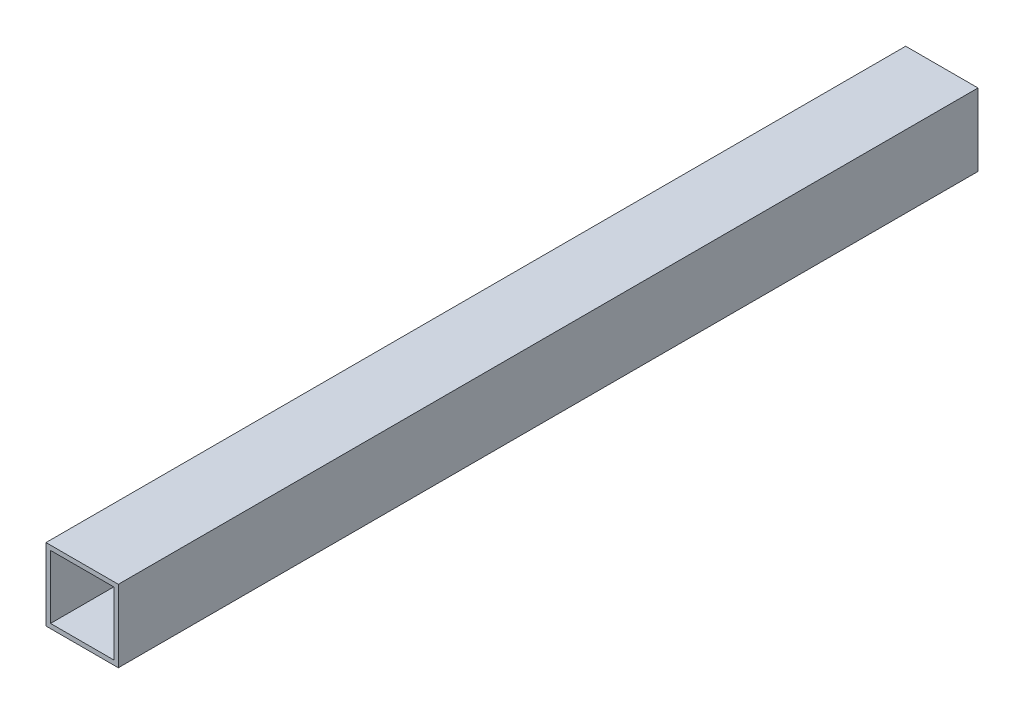
ISO-10303-21;
HEADER;
FILE_DESCRIPTION(('STEP AP214'),'2;1');
FILE_NAME('part.step','',(''),(''),'','','');
FILE_SCHEMA(('AUTOMOTIVE_DESIGN { 1 0 10303 214 1 1 1 1 }'));
ENDSEC;
DATA;
#1=APPLICATION_CONTEXT('core data for automotive mechanical design processes');
#2=APPLICATION_PROTOCOL_DEFINITION('international standard','automotive_design',2000,#1);
#3=PRODUCT_CONTEXT('',#1,'mechanical');
#4=PRODUCT('Part','Part','',(#3));
#5=PRODUCT_RELATED_PRODUCT_CATEGORY('part','',(#4));
#6=PRODUCT_DEFINITION_FORMATION('','',#4);
#7=PRODUCT_DEFINITION_CONTEXT('part definition',#1,'design');
#8=PRODUCT_DEFINITION('design','',#6,#7);
#9=PRODUCT_DEFINITION_SHAPE('','',#8);
#10=(LENGTH_UNIT() NAMED_UNIT(*) SI_UNIT(.MILLI.,.METRE.));
#11=(NAMED_UNIT(*) PLANE_ANGLE_UNIT() SI_UNIT($,.RADIAN.));
#12=(NAMED_UNIT(*) SI_UNIT($,.STERADIAN.) SOLID_ANGLE_UNIT());
#13=UNCERTAINTY_MEASURE_WITH_UNIT(LENGTH_MEASURE(1.E-05),#10,'distance_accuracy_value','');
#14=(GEOMETRIC_REPRESENTATION_CONTEXT(3) GLOBAL_UNCERTAINTY_ASSIGNED_CONTEXT((#13)) GLOBAL_UNIT_ASSIGNED_CONTEXT((#10,
#11,#12)) REPRESENTATION_CONTEXT('',''));
#15=CARTESIAN_POINT('',(0.,0.,0.));
#16=DIRECTION('',(0.,0.,1.));
#17=DIRECTION('',(1.,0.,0.));
#18=AXIS2_PLACEMENT_3D('',#15,#16,#17);
#19=CARTESIAN_POINT('',(0.,0.,150.969853));
#20=DIRECTION('',(0.,0.,-1.));
#21=DIRECTION('',(-1.,0.,0.));
#22=AXIS2_PLACEMENT_3D('',#19,#20,#21);
#23=PLANE('',#22);
#24=DIRECTION('',(0.,1.,0.));
#25=VECTOR('',#24,1.);
#26=CARTESIAN_POINT('',(12.7,-12.7,150.969853));
#27=LINE('',#26,#25);
#28=CARTESIAN_POINT('',(12.7,-12.7,150.969853));
#29=VERTEX_POINT('',#28);
#30=CARTESIAN_POINT('',(12.7,12.7,150.969853));
#31=VERTEX_POINT('',#30);
#32=EDGE_CURVE('E134',#29,#31,#27,.T.);
#33=ORIENTED_EDGE('',*,*,#32,.T.);
#34=DIRECTION('',(-1.,0.,0.));
#35=VECTOR('',#34,1.);
#36=CARTESIAN_POINT('',(-12.7,12.7,150.969853));
#37=LINE('',#36,#35);
#38=CARTESIAN_POINT('',(-12.7,12.7,150.969853));
#39=VERTEX_POINT('',#38);
#40=EDGE_CURVE('E137',#31,#39,#37,.T.);
#41=ORIENTED_EDGE('',*,*,#40,.T.);
#42=DIRECTION('',(0.,-1.,0.));
#43=VECTOR('',#42,1.);
#44=CARTESIAN_POINT('',(-12.7,-12.7,150.969853));
#45=LINE('',#44,#43);
#46=CARTESIAN_POINT('',(-12.7,-12.7,150.969853));
#47=VERTEX_POINT('',#46);
#48=EDGE_CURVE('E140',#39,#47,#45,.T.);
#49=ORIENTED_EDGE('',*,*,#48,.T.);
#50=DIRECTION('',(1.,0.,0.));
#51=VECTOR('',#50,1.);
#52=CARTESIAN_POINT('',(-12.7,-12.7,150.969853));
#53=LINE('',#52,#51);
#54=EDGE_CURVE('E142',#47,#29,#53,.T.);
#55=ORIENTED_EDGE('',*,*,#54,.T.);
#56=EDGE_LOOP('',(#33,#41,#49,#55));
#57=FACE_BOUND('',#56,.T.);
#58=DIRECTION('',(0.,1.,0.));
#59=VECTOR('',#58,1.);
#60=CARTESIAN_POINT('',(11.1125,-11.1125,150.969853));
#61=LINE('',#60,#59);
#62=CARTESIAN_POINT('',(11.1125,-11.1125,150.969853));
#63=VERTEX_POINT('',#62);
#64=CARTESIAN_POINT('',(11.1125,11.1125,150.969853));
#65=VERTEX_POINT('',#64);
#66=EDGE_CURVE('E98',#63,#65,#61,.T.);
#67=ORIENTED_EDGE('',*,*,#66,.F.);
#68=DIRECTION('',(1.,0.,0.));
#69=VECTOR('',#68,1.);
#70=CARTESIAN_POINT('',(-11.1125,-11.1125,150.969853));
#71=LINE('',#70,#69);
#72=CARTESIAN_POINT('',(-11.1125,-11.1125,150.969853));
#73=VERTEX_POINT('',#72);
#74=EDGE_CURVE('E120',#73,#63,#71,.T.);
#75=ORIENTED_EDGE('',*,*,#74,.F.);
#76=DIRECTION('',(0.,-1.,0.));
#77=VECTOR('',#76,1.);
#78=CARTESIAN_POINT('',(-11.1125,-11.1125,150.969853));
#79=LINE('',#78,#77);
#80=CARTESIAN_POINT('',(-11.1125,11.1125,150.969853));
#81=VERTEX_POINT('',#80);
#82=EDGE_CURVE('E118',#81,#73,#79,.T.);
#83=ORIENTED_EDGE('',*,*,#82,.F.);
#84=DIRECTION('',(-1.,0.,0.));
#85=VECTOR('',#84,1.);
#86=CARTESIAN_POINT('',(-11.1125,11.1125,150.969853));
#87=LINE('',#86,#85);
#88=EDGE_CURVE('E106',#65,#81,#87,.T.);
#89=ORIENTED_EDGE('',*,*,#88,.F.);
#90=EDGE_LOOP('',(#67,#75,#83,#89));
#91=FACE_BOUND('',#90,.T.);
#92=ADVANCED_FACE('F33',(#57,#91),#23,.F.);
#93=CARTESIAN_POINT('',(0.,0.,-150.969853));
#94=DIRECTION('',(0.,0.,-1.));
#95=DIRECTION('',(-1.,0.,0.));
#96=AXIS2_PLACEMENT_3D('',#93,#94,#95);
#97=PLANE('',#96);
#98=DIRECTION('',(0.,1.,0.));
#99=VECTOR('',#98,1.);
#100=CARTESIAN_POINT('',(12.7,-12.7,-150.969853));
#101=LINE('',#100,#99);
#102=CARTESIAN_POINT('',(12.7,-12.7,-150.969853));
#103=VERTEX_POINT('',#102);
#104=CARTESIAN_POINT('',(12.7,12.7,-150.969853));
#105=VERTEX_POINT('',#104);
#106=EDGE_CURVE('E114',#103,#105,#101,.T.);
#107=ORIENTED_EDGE('',*,*,#106,.F.);
#108=DIRECTION('',(1.,0.,0.));
#109=VECTOR('',#108,1.);
#110=CARTESIAN_POINT('',(-12.7,-12.7,-150.969853));
#111=LINE('',#110,#109);
#112=CARTESIAN_POINT('',(-12.7,-12.7,-150.969853));
#113=VERTEX_POINT('',#112);
#114=EDGE_CURVE('E138',#113,#103,#111,.T.);
#115=ORIENTED_EDGE('',*,*,#114,.F.);
#116=DIRECTION('',(0.,-1.,0.));
#117=VECTOR('',#116,1.);
#118=CARTESIAN_POINT('',(-12.7,-12.7,-150.969853));
#119=LINE('',#118,#117);
#120=CARTESIAN_POINT('',(-12.7,12.7,-150.969853));
#121=VERTEX_POINT('',#120);
#122=EDGE_CURVE('E149',#121,#113,#119,.T.);
#123=ORIENTED_EDGE('',*,*,#122,.F.);
#124=DIRECTION('',(-1.,0.,0.));
#125=VECTOR('',#124,1.);
#126=CARTESIAN_POINT('',(-12.7,12.7,-150.969853));
#127=LINE('',#126,#125);
#128=EDGE_CURVE('E147',#105,#121,#127,.T.);
#129=ORIENTED_EDGE('',*,*,#128,.F.);
#130=EDGE_LOOP('',(#107,#115,#123,#129));
#131=FACE_BOUND('',#130,.T.);
#132=DIRECTION('',(1.,0.,0.));
#133=VECTOR('',#132,1.);
#134=CARTESIAN_POINT('',(-11.1125,-11.1125,-150.969853));
#135=LINE('',#134,#133);
#136=CARTESIAN_POINT('',(-11.1125,-11.1125,-150.969853));
#137=VERTEX_POINT('',#136);
#138=CARTESIAN_POINT('',(11.1125,-11.1125,-150.969853));
#139=VERTEX_POINT('',#138);
#140=EDGE_CURVE('E107',#137,#139,#135,.T.);
#141=ORIENTED_EDGE('',*,*,#140,.T.);
#142=DIRECTION('',(0.,1.,0.));
#143=VECTOR('',#142,1.);
#144=CARTESIAN_POINT('',(11.1125,-11.1125,-150.969853));
#145=LINE('',#144,#143);
#146=CARTESIAN_POINT('',(11.1125,11.1125,-150.969853));
#147=VERTEX_POINT('',#146);
#148=EDGE_CURVE('E56',#139,#147,#145,.T.);
#149=ORIENTED_EDGE('',*,*,#148,.T.);
#150=DIRECTION('',(-1.,0.,0.));
#151=VECTOR('',#150,1.);
#152=CARTESIAN_POINT('',(-11.1125,11.1125,-150.969853));
#153=LINE('',#152,#151);
#154=CARTESIAN_POINT('',(-11.1125,11.1125,-150.969853));
#155=VERTEX_POINT('',#154);
#156=EDGE_CURVE('E113',#147,#155,#153,.T.);
#157=ORIENTED_EDGE('',*,*,#156,.T.);
#158=DIRECTION('',(0.,-1.,0.));
#159=VECTOR('',#158,1.);
#160=CARTESIAN_POINT('',(-11.1125,-11.1125,-150.969853));
#161=LINE('',#160,#159);
#162=EDGE_CURVE('E126',#155,#137,#161,.T.);
#163=ORIENTED_EDGE('',*,*,#162,.T.);
#164=EDGE_LOOP('',(#141,#149,#157,#163));
#165=FACE_BOUND('',#164,.T.);
#166=ADVANCED_FACE('F167',(#131,#165),#97,.T.);
#167=CARTESIAN_POINT('',(12.7,-12.7,150.969853));
#168=DIRECTION('',(-1.,0.,0.));
#169=DIRECTION('',(0.,0.,1.));
#170=AXIS2_PLACEMENT_3D('',#167,#168,#169);
#171=PLANE('',#170);
#172=ORIENTED_EDGE('',*,*,#106,.T.);
#173=DIRECTION('',(0.,0.,-1.));
#174=VECTOR('',#173,1.);
#175=CARTESIAN_POINT('',(12.7,12.7,150.969853));
#176=LINE('',#175,#174);
#177=EDGE_CURVE('E11',#31,#105,#176,.T.);
#178=ORIENTED_EDGE('',*,*,#177,.F.);
#179=ORIENTED_EDGE('',*,*,#32,.F.);
#180=DIRECTION('',(0.,0.,-1.));
#181=VECTOR('',#180,1.);
#182=CARTESIAN_POINT('',(12.7,-12.7,150.969853));
#183=LINE('',#182,#181);
#184=EDGE_CURVE('E144',#29,#103,#183,.T.);
#185=ORIENTED_EDGE('',*,*,#184,.T.);
#186=EDGE_LOOP('',(#172,#178,#179,#185));
#187=FACE_BOUND('',#186,.T.);
#188=ADVANCED_FACE('F35',(#187),#171,.F.);
#189=CARTESIAN_POINT('',(-12.7,12.7,150.969853));
#190=DIRECTION('',(0.,-1.,0.));
#191=DIRECTION('',(0.,0.,-1.));
#192=AXIS2_PLACEMENT_3D('',#189,#190,#191);
#193=PLANE('',#192);
#194=ORIENTED_EDGE('',*,*,#128,.T.);
#195=DIRECTION('',(0.,0.,-1.));
#196=VECTOR('',#195,1.);
#197=CARTESIAN_POINT('',(-12.7,12.7,150.969853));
#198=LINE('',#197,#196);
#199=EDGE_CURVE('E41',#39,#121,#198,.T.);
#200=ORIENTED_EDGE('',*,*,#199,.F.);
#201=ORIENTED_EDGE('',*,*,#40,.F.);
#202=ORIENTED_EDGE('',*,*,#177,.T.);
#203=EDGE_LOOP('',(#194,#200,#201,#202));
#204=FACE_BOUND('',#203,.T.);
#205=ADVANCED_FACE('F177',(#204),#193,.F.);
#206=CARTESIAN_POINT('',(-12.7,-12.7,150.969853));
#207=DIRECTION('',(1.,0.,0.));
#208=DIRECTION('',(0.,0.,-1.));
#209=AXIS2_PLACEMENT_3D('',#206,#207,#208);
#210=PLANE('',#209);
#211=ORIENTED_EDGE('',*,*,#122,.T.);
#212=DIRECTION('',(0.,0.,-1.));
#213=VECTOR('',#212,1.);
#214=CARTESIAN_POINT('',(-12.7,-12.7,150.969853));
#215=LINE('',#214,#213);
#216=EDGE_CURVE('E154',#47,#113,#215,.T.);
#217=ORIENTED_EDGE('',*,*,#216,.F.);
#218=ORIENTED_EDGE('',*,*,#48,.F.);
#219=ORIENTED_EDGE('',*,*,#199,.T.);
#220=EDGE_LOOP('',(#211,#217,#218,#219));
#221=FACE_BOUND('',#220,.T.);
#222=ADVANCED_FACE('F161',(#221),#210,.F.);
#223=CARTESIAN_POINT('',(-12.7,-12.7,150.969853));
#224=DIRECTION('',(0.,1.,0.));
#225=DIRECTION('',(0.,0.,1.));
#226=AXIS2_PLACEMENT_3D('',#223,#224,#225);
#227=PLANE('',#226);
#228=ORIENTED_EDGE('',*,*,#114,.T.);
#229=ORIENTED_EDGE('',*,*,#184,.F.);
#230=ORIENTED_EDGE('',*,*,#54,.F.);
#231=ORIENTED_EDGE('',*,*,#216,.T.);
#232=EDGE_LOOP('',(#228,#229,#230,#231));
#233=FACE_BOUND('',#232,.T.);
#234=ADVANCED_FACE('F171',(#233),#227,.F.);
#235=CARTESIAN_POINT('',(11.1125,-11.1125,150.969853));
#236=DIRECTION('',(-1.,0.,0.));
#237=DIRECTION('',(0.,0.,1.));
#238=AXIS2_PLACEMENT_3D('',#235,#236,#237);
#239=PLANE('',#238);
#240=ORIENTED_EDGE('',*,*,#148,.F.);
#241=DIRECTION('',(0.,0.,-1.));
#242=VECTOR('',#241,1.);
#243=CARTESIAN_POINT('',(11.1125,-11.1125,150.969853));
#244=LINE('',#243,#242);
#245=EDGE_CURVE('E102',#63,#139,#244,.T.);
#246=ORIENTED_EDGE('',*,*,#245,.F.);
#247=ORIENTED_EDGE('',*,*,#66,.T.);
#248=DIRECTION('',(0.,0.,-1.));
#249=VECTOR('',#248,1.);
#250=CARTESIAN_POINT('',(11.1125,11.1125,150.969853));
#251=LINE('',#250,#249);
#252=EDGE_CURVE('E101',#65,#147,#251,.T.);
#253=ORIENTED_EDGE('',*,*,#252,.T.);
#254=EDGE_LOOP('',(#240,#246,#247,#253));
#255=FACE_BOUND('',#254,.T.);
#256=ADVANCED_FACE('F100',(#255),#239,.T.);
#257=CARTESIAN_POINT('',(-11.1125,11.1125,150.969853));
#258=DIRECTION('',(0.,-1.,0.));
#259=DIRECTION('',(0.,0.,-1.));
#260=AXIS2_PLACEMENT_3D('',#257,#258,#259);
#261=PLANE('',#260);
#262=ORIENTED_EDGE('',*,*,#156,.F.);
#263=ORIENTED_EDGE('',*,*,#252,.F.);
#264=ORIENTED_EDGE('',*,*,#88,.T.);
#265=DIRECTION('',(0.,0.,-1.));
#266=VECTOR('',#265,1.);
#267=CARTESIAN_POINT('',(-11.1125,11.1125,150.969853));
#268=LINE('',#267,#266);
#269=EDGE_CURVE('E115',#81,#155,#268,.T.);
#270=ORIENTED_EDGE('',*,*,#269,.T.);
#271=EDGE_LOOP('',(#262,#263,#264,#270));
#272=FACE_BOUND('',#271,.T.);
#273=ADVANCED_FACE('F110',(#272),#261,.T.);
#274=CARTESIAN_POINT('',(-11.1125,-11.1125,150.969853));
#275=DIRECTION('',(1.,0.,0.));
#276=DIRECTION('',(0.,0.,-1.));
#277=AXIS2_PLACEMENT_3D('',#274,#275,#276);
#278=PLANE('',#277);
#279=ORIENTED_EDGE('',*,*,#162,.F.);
#280=ORIENTED_EDGE('',*,*,#269,.F.);
#281=ORIENTED_EDGE('',*,*,#82,.T.);
#282=DIRECTION('',(0.,0.,-1.));
#283=VECTOR('',#282,1.);
#284=CARTESIAN_POINT('',(-11.1125,-11.1125,150.969853));
#285=LINE('',#284,#283);
#286=EDGE_CURVE('E48',#73,#137,#285,.T.);
#287=ORIENTED_EDGE('',*,*,#286,.T.);
#288=EDGE_LOOP('',(#279,#280,#281,#287));
#289=FACE_BOUND('',#288,.T.);
#290=ADVANCED_FACE('F200',(#289),#278,.T.);
#291=CARTESIAN_POINT('',(-11.1125,-11.1125,150.969853));
#292=DIRECTION('',(0.,1.,0.));
#293=DIRECTION('',(0.,0.,1.));
#294=AXIS2_PLACEMENT_3D('',#291,#292,#293);
#295=PLANE('',#294);
#296=ORIENTED_EDGE('',*,*,#140,.F.);
#297=ORIENTED_EDGE('',*,*,#286,.F.);
#298=ORIENTED_EDGE('',*,*,#74,.T.);
#299=ORIENTED_EDGE('',*,*,#245,.T.);
#300=EDGE_LOOP('',(#296,#297,#298,#299));
#301=FACE_BOUND('',#300,.T.);
#302=ADVANCED_FACE('F204',(#301),#295,.T.);
#303=CLOSED_SHELL('',(#92,#166,#188,#205,#222,#234,#256,#273,#290,#302));
#304=MANIFOLD_SOLID_BREP('B2',#303);
#305=ADVANCED_BREP_SHAPE_REPRESENTATION('',(#18,#304),#14);
#306=SHAPE_DEFINITION_REPRESENTATION(#9,#305);
ENDSEC;
END-ISO-10303-21;
